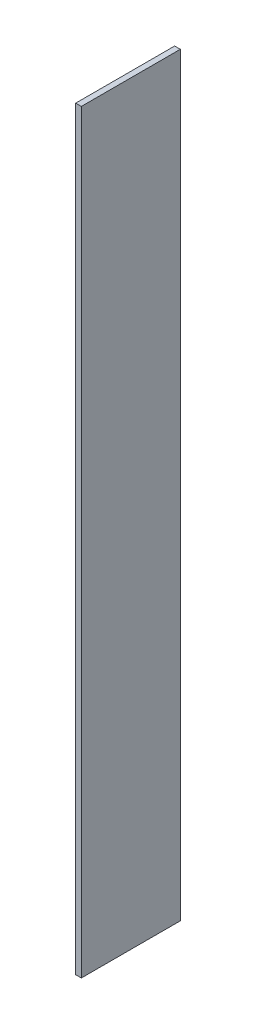
ISO-10303-21;
HEADER;
FILE_DESCRIPTION(('STEP AP214'),'2;1');
FILE_NAME('part.step','',(''),(''),'','','');
FILE_SCHEMA(('AUTOMOTIVE_DESIGN { 1 0 10303 214 1 1 1 1 }'));
ENDSEC;
DATA;
#1=APPLICATION_CONTEXT('core data for automotive mechanical design processes');
#2=APPLICATION_PROTOCOL_DEFINITION('international standard','automotive_design',2000,#1);
#3=PRODUCT_CONTEXT('',#1,'mechanical');
#4=PRODUCT('Part','Part','',(#3));
#5=PRODUCT_RELATED_PRODUCT_CATEGORY('part','',(#4));
#6=PRODUCT_DEFINITION_FORMATION('','',#4);
#7=PRODUCT_DEFINITION_CONTEXT('part definition',#1,'design');
#8=PRODUCT_DEFINITION('design','',#6,#7);
#9=PRODUCT_DEFINITION_SHAPE('','',#8);
#10=(LENGTH_UNIT() NAMED_UNIT(*) SI_UNIT(.MILLI.,.METRE.));
#11=(NAMED_UNIT(*) PLANE_ANGLE_UNIT() SI_UNIT($,.RADIAN.));
#12=(NAMED_UNIT(*) SI_UNIT($,.STERADIAN.) SOLID_ANGLE_UNIT());
#13=UNCERTAINTY_MEASURE_WITH_UNIT(LENGTH_MEASURE(1.E-05),#10,'distance_accuracy_value','');
#14=(GEOMETRIC_REPRESENTATION_CONTEXT(3) GLOBAL_UNCERTAINTY_ASSIGNED_CONTEXT((#13)) GLOBAL_UNIT_ASSIGNED_CONTEXT((#10,
#11,#12)) REPRESENTATION_CONTEXT('',''));
#15=CARTESIAN_POINT('',(0.,0.,0.));
#16=DIRECTION('',(0.,0.,1.));
#17=DIRECTION('',(1.,0.,0.));
#18=AXIS2_PLACEMENT_3D('',#15,#16,#17);
#19=CARTESIAN_POINT('',(1.00000000000002,603.230303623996,-10.1481942013614));
#20=DIRECTION('',(1.,0.,0.));
#21=DIRECTION('',(0.,0.,-1.));
#22=AXIS2_PLACEMENT_3D('',#19,#20,#21);
#23=PLANE('',#22);
#24=DIRECTION('',(0.,0.,1.));
#25=VECTOR('',#24,1.);
#26=CARTESIAN_POINT('',(1.00000000000002,533.213673316679,-10.1481942013614));
#27=LINE('',#26,#25);
#28=CARTESIAN_POINT('',(1.00000000000002,533.213673316679,-10.1481942013614));
#29=VERTEX_POINT('',#28);
#30=CARTESIAN_POINT('',(1.00000000000002,533.213673316679,59.754084156297));
#31=VERTEX_POINT('',#30);
#32=EDGE_CURVE('E82',#29,#31,#27,.T.);
#33=ORIENTED_EDGE('',*,*,#32,.F.);
#34=DIRECTION('',(0.,-1.,0.));
#35=VECTOR('',#34,1.);
#36=CARTESIAN_POINT('',(1.00000000000002,603.230303623996,-10.1481942013614));
#37=LINE('',#36,#35);
#38=CARTESIAN_POINT('',(1.00000000000002,0.,-10.1481942013614));
#39=VERTEX_POINT('',#38);
#40=EDGE_CURVE('E36',#29,#39,#37,.T.);
#41=ORIENTED_EDGE('',*,*,#40,.T.);
#42=DIRECTION('',(0.,0.,1.));
#43=VECTOR('',#42,1.);
#44=CARTESIAN_POINT('',(1.00000000000002,0.,-10.1481942013614));
#45=LINE('',#44,#43);
#46=CARTESIAN_POINT('',(1.00000000000002,0.,59.754084156297));
#47=VERTEX_POINT('',#46);
#48=EDGE_CURVE('E80',#39,#47,#45,.T.);
#49=ORIENTED_EDGE('',*,*,#48,.T.);
#50=DIRECTION('',(0.,-1.,0.));
#51=VECTOR('',#50,1.);
#52=CARTESIAN_POINT('',(1.00000000000002,603.230303623996,59.754084156297));
#53=LINE('',#52,#51);
#54=EDGE_CURVE('E71',#31,#47,#53,.T.);
#55=ORIENTED_EDGE('',*,*,#54,.F.);
#56=EDGE_LOOP('',(#33,#41,#49,#55));
#57=FACE_BOUND('',#56,.T.);
#58=ADVANCED_FACE('F32',(#57),#23,.F.);
#59=CARTESIAN_POINT('',(1.00000000000002,603.230303623996,59.754084156297));
#60=DIRECTION('',(0.,0.,-1.));
#61=DIRECTION('',(-1.,0.,0.));
#62=AXIS2_PLACEMENT_3D('',#59,#60,#61);
#63=PLANE('',#62);
#64=DIRECTION('',(1.,0.,0.));
#65=VECTOR('',#64,1.);
#66=CARTESIAN_POINT('',(1.00000000000003,533.213673316679,59.754084156297));
#67=LINE('',#66,#65);
#68=CARTESIAN_POINT('',(5.00000000000002,533.213673316679,59.754084156297));
#69=VERTEX_POINT('',#68);
#70=EDGE_CURVE('E41',#31,#69,#67,.T.);
#71=ORIENTED_EDGE('',*,*,#70,.F.);
#72=ORIENTED_EDGE('',*,*,#54,.T.);
#73=DIRECTION('',(1.,0.,0.));
#74=VECTOR('',#73,1.);
#75=CARTESIAN_POINT('',(1.00000000000002,0.,59.754084156297));
#76=LINE('',#75,#74);
#77=CARTESIAN_POINT('',(5.00000000000002,0.,59.754084156297));
#78=VERTEX_POINT('',#77);
#79=EDGE_CURVE('E92',#47,#78,#76,.T.);
#80=ORIENTED_EDGE('',*,*,#79,.T.);
#81=DIRECTION('',(0.,-1.,0.));
#82=VECTOR('',#81,1.);
#83=CARTESIAN_POINT('',(5.00000000000002,603.230303623996,59.754084156297));
#84=LINE('',#83,#82);
#85=EDGE_CURVE('E101',#69,#78,#84,.T.);
#86=ORIENTED_EDGE('',*,*,#85,.F.);
#87=EDGE_LOOP('',(#71,#72,#80,#86));
#88=FACE_BOUND('',#87,.T.);
#89=ADVANCED_FACE('F105',(#88),#63,.F.);
#90=CARTESIAN_POINT('',(5.00000000000002,603.230303623996,-10.1481942013614));
#91=DIRECTION('',(-1.,0.,0.));
#92=DIRECTION('',(0.,0.,1.));
#93=AXIS2_PLACEMENT_3D('',#90,#91,#92);
#94=PLANE('',#93);
#95=DIRECTION('',(0.,0.,-1.));
#96=VECTOR('',#95,1.);
#97=CARTESIAN_POINT('',(5.00000000000002,533.213673316679,-10.1481942013614));
#98=LINE('',#97,#96);
#99=CARTESIAN_POINT('',(5.00000000000002,533.213673316679,-10.1481942013614));
#100=VERTEX_POINT('',#99);
#101=EDGE_CURVE('E11',#69,#100,#98,.T.);
#102=ORIENTED_EDGE('',*,*,#101,.F.);
#103=ORIENTED_EDGE('',*,*,#85,.T.);
#104=DIRECTION('',(0.,0.,-1.));
#105=VECTOR('',#104,1.);
#106=CARTESIAN_POINT('',(5.00000000000002,0.,-10.1481942013614));
#107=LINE('',#106,#105);
#108=CARTESIAN_POINT('',(5.00000000000002,0.,-10.1481942013614));
#109=VERTEX_POINT('',#108);
#110=EDGE_CURVE('E102',#78,#109,#107,.T.);
#111=ORIENTED_EDGE('',*,*,#110,.T.);
#112=DIRECTION('',(0.,-1.,0.));
#113=VECTOR('',#112,1.);
#114=CARTESIAN_POINT('',(5.00000000000002,603.230303623996,-10.1481942013614));
#115=LINE('',#114,#113);
#116=EDGE_CURVE('E54',#100,#109,#115,.T.);
#117=ORIENTED_EDGE('',*,*,#116,.F.);
#118=EDGE_LOOP('',(#102,#103,#111,#117));
#119=FACE_BOUND('',#118,.T.);
#120=ADVANCED_FACE('F104',(#119),#94,.F.);
#121=CARTESIAN_POINT('',(1.00000000000002,603.230303623996,-10.1481942013614));
#122=DIRECTION('',(0.,0.,1.));
#123=DIRECTION('',(1.,0.,0.));
#124=AXIS2_PLACEMENT_3D('',#121,#122,#123);
#125=PLANE('',#124);
#126=DIRECTION('',(-1.,0.,0.));
#127=VECTOR('',#126,1.);
#128=CARTESIAN_POINT('',(1.00000000000002,533.213673316679,-10.1481942013614));
#129=LINE('',#128,#127);
#130=EDGE_CURVE('E89',#100,#29,#129,.T.);
#131=ORIENTED_EDGE('',*,*,#130,.F.);
#132=ORIENTED_EDGE('',*,*,#116,.T.);
#133=DIRECTION('',(-1.,0.,0.));
#134=VECTOR('',#133,1.);
#135=CARTESIAN_POINT('',(1.00000000000002,0.,-10.1481942013614));
#136=LINE('',#135,#134);
#137=EDGE_CURVE('E85',#109,#39,#136,.T.);
#138=ORIENTED_EDGE('',*,*,#137,.T.);
#139=ORIENTED_EDGE('',*,*,#40,.F.);
#140=EDGE_LOOP('',(#131,#132,#138,#139));
#141=FACE_BOUND('',#140,.T.);
#142=ADVANCED_FACE('F86',(#141),#125,.F.);
#143=CARTESIAN_POINT('',(1.00000000000002,0.,59.754084156297));
#144=DIRECTION('',(0.,1.,0.));
#145=DIRECTION('',(0.,0.,1.));
#146=AXIS2_PLACEMENT_3D('',#143,#144,#145);
#147=PLANE('',#146);
#148=ORIENTED_EDGE('',*,*,#48,.F.);
#149=ORIENTED_EDGE('',*,*,#137,.F.);
#150=ORIENTED_EDGE('',*,*,#110,.F.);
#151=ORIENTED_EDGE('',*,*,#79,.F.);
#152=EDGE_LOOP('',(#148,#149,#150,#151));
#153=FACE_BOUND('',#152,.T.);
#154=ADVANCED_FACE('F91',(#153),#147,.F.);
#155=CARTESIAN_POINT('',(9.51267245440294,533.213673316679,-113.524723044401));
#156=DIRECTION('',(0.,1.,0.));
#157=DIRECTION('',(0.,0.,-1.));
#158=AXIS2_PLACEMENT_3D('',#155,#156,#157);
#159=PLANE('',#158);
#160=ORIENTED_EDGE('',*,*,#130,.T.);
#161=ORIENTED_EDGE('',*,*,#32,.T.);
#162=ORIENTED_EDGE('',*,*,#70,.T.);
#163=ORIENTED_EDGE('',*,*,#101,.T.);
#164=EDGE_LOOP('',(#160,#161,#162,#163));
#165=FACE_BOUND('',#164,.T.);
#166=ADVANCED_FACE('F34',(#165),#159,.T.);
#167=CLOSED_SHELL('',(#58,#89,#120,#142,#154,#166));
#168=MANIFOLD_SOLID_BREP('B2',#167);
#169=ADVANCED_BREP_SHAPE_REPRESENTATION('',(#18,#168),#14);
#170=SHAPE_DEFINITION_REPRESENTATION(#9,#169);
ENDSEC;
END-ISO-10303-21;
